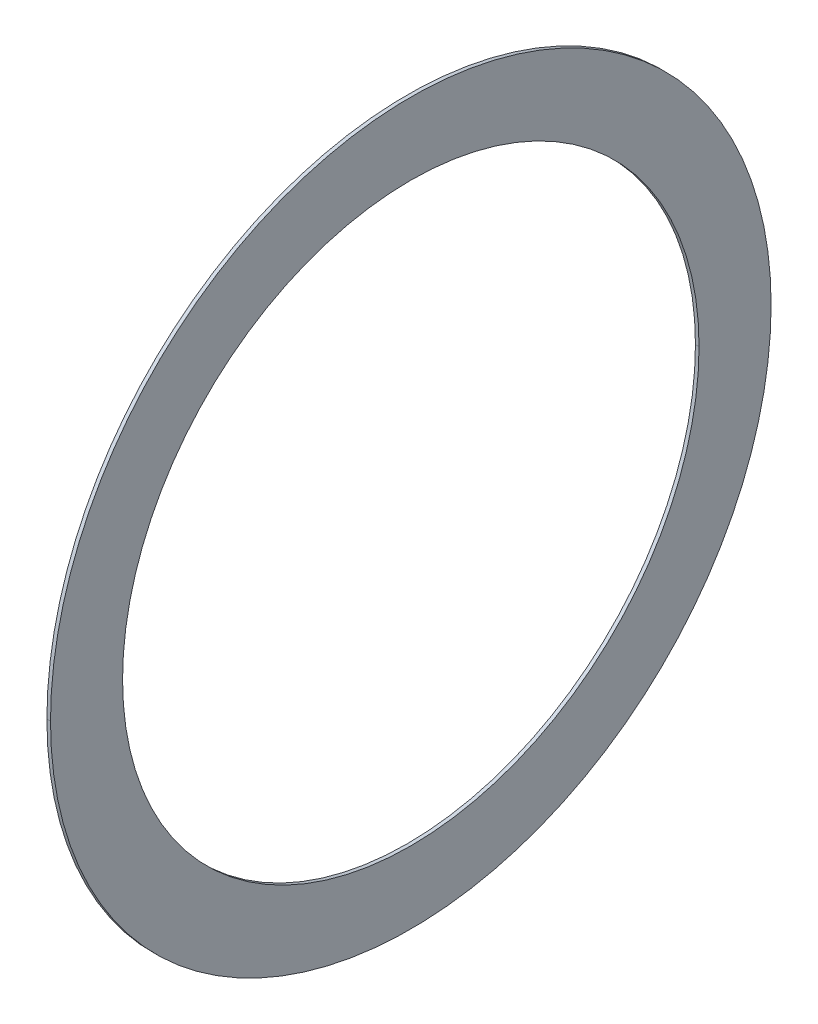
ISO-10303-21;
HEADER;
FILE_DESCRIPTION(('STEP AP214'),'2;1');
FILE_NAME('part.step','',(''),(''),'','','');
FILE_SCHEMA(('AUTOMOTIVE_DESIGN { 1 0 10303 214 1 1 1 1 }'));
ENDSEC;
DATA;
#1=APPLICATION_CONTEXT('core data for automotive mechanical design processes');
#2=APPLICATION_PROTOCOL_DEFINITION('international standard','automotive_design',2000,#1);
#3=PRODUCT_CONTEXT('',#1,'mechanical');
#4=PRODUCT('Part','Part','',(#3));
#5=PRODUCT_RELATED_PRODUCT_CATEGORY('part','',(#4));
#6=PRODUCT_DEFINITION_FORMATION('','',#4);
#7=PRODUCT_DEFINITION_CONTEXT('part definition',#1,'design');
#8=PRODUCT_DEFINITION('design','',#6,#7);
#9=PRODUCT_DEFINITION_SHAPE('','',#8);
#10=(LENGTH_UNIT() NAMED_UNIT(*) SI_UNIT(.MILLI.,.METRE.));
#11=(NAMED_UNIT(*) PLANE_ANGLE_UNIT() SI_UNIT($,.RADIAN.));
#12=(NAMED_UNIT(*) SI_UNIT($,.STERADIAN.) SOLID_ANGLE_UNIT());
#13=UNCERTAINTY_MEASURE_WITH_UNIT(LENGTH_MEASURE(1.E-05),#10,'distance_accuracy_value','');
#14=(GEOMETRIC_REPRESENTATION_CONTEXT(3) GLOBAL_UNCERTAINTY_ASSIGNED_CONTEXT((#13)) GLOBAL_UNIT_ASSIGNED_CONTEXT((#10,
#11,#12)) REPRESENTATION_CONTEXT('',''));
#15=CARTESIAN_POINT('',(0.,0.,0.));
#16=DIRECTION('',(0.,0.,1.));
#17=DIRECTION('',(1.,0.,0.));
#18=AXIS2_PLACEMENT_3D('',#15,#16,#17);
#19=CARTESIAN_POINT('',(2.5,100.,0.));
#20=DIRECTION('',(-1.,0.,0.));
#21=DIRECTION('',(0.,0.,1.));
#22=AXIS2_PLACEMENT_3D('',#19,#20,#21);
#23=PLANE('',#22);
#24=CARTESIAN_POINT('',(2.5,0.,0.));
#25=DIRECTION('',(1.,0.,0.));
#26=DIRECTION('',(0.,0.,-1.));
#27=AXIS2_PLACEMENT_3D('',#24,#25,#26);
#28=CIRCLE('',#27,80.);
#29=CARTESIAN_POINT('',(2.5,0.,-80.));
#30=VERTEX_POINT('',#29);
#31=CARTESIAN_POINT('',(2.5,0.,80.));
#32=VERTEX_POINT('',#31);
#33=EDGE_CURVE('E11',#30,#32,#28,.T.);
#34=ORIENTED_EDGE('',*,*,#33,.T.);
#35=CARTESIAN_POINT('',(2.5,0.,0.));
#36=DIRECTION('',(1.,0.,0.));
#37=DIRECTION('',(0.,0.,-1.));
#38=AXIS2_PLACEMENT_3D('',#35,#36,#37);
#39=CIRCLE('',#38,80.);
#40=EDGE_CURVE('E25',#32,#30,#39,.T.);
#41=ORIENTED_EDGE('',*,*,#40,.T.);
#42=EDGE_LOOP('',(#34,#41));
#43=FACE_BOUND('',#42,.T.);
#44=CARTESIAN_POINT('',(2.5,0.,0.));
#45=DIRECTION('',(1.,0.,0.));
#46=DIRECTION('',(0.,0.,-1.));
#47=AXIS2_PLACEMENT_3D('',#44,#45,#46);
#48=CIRCLE('',#47,100.);
#49=CARTESIAN_POINT('',(2.5,0.,100.));
#50=VERTEX_POINT('',#49);
#51=CARTESIAN_POINT('',(2.5,0.,-100.));
#52=VERTEX_POINT('',#51);
#53=EDGE_CURVE('E95',#50,#52,#48,.T.);
#54=ORIENTED_EDGE('',*,*,#53,.F.);
#55=CARTESIAN_POINT('',(2.5,0.,0.));
#56=DIRECTION('',(1.,0.,0.));
#57=DIRECTION('',(0.,0.,-1.));
#58=AXIS2_PLACEMENT_3D('',#55,#56,#57);
#59=CIRCLE('',#58,100.);
#60=EDGE_CURVE('E90',#52,#50,#59,.T.);
#61=ORIENTED_EDGE('',*,*,#60,.F.);
#62=EDGE_LOOP('',(#54,#61));
#63=FACE_BOUND('',#62,.T.);
#64=ADVANCED_FACE('F17',(#43,#63),#23,.T.);
#65=CARTESIAN_POINT('',(50.,0.,0.));
#66=DIRECTION('',(1.,0.,0.));
#67=DIRECTION('',(0.,-1.,0.));
#68=AXIS2_PLACEMENT_3D('',#65,#66,#67);
#69=CYLINDRICAL_SURFACE('',#68,100.);
#70=DIRECTION('',(1.,0.,0.));
#71=VECTOR('',#70,1.);
#72=CARTESIAN_POINT('',(2.5,0.,100.));
#73=LINE('',#72,#71);
#74=CARTESIAN_POINT('',(3.5,0.,100.));
#75=VERTEX_POINT('',#74);
#76=EDGE_CURVE('E86',#50,#75,#73,.T.);
#77=ORIENTED_EDGE('',*,*,#76,.T.);
#78=CARTESIAN_POINT('',(3.5,0.,0.));
#79=DIRECTION('',(1.,0.,0.));
#80=DIRECTION('',(0.,0.,-1.));
#81=AXIS2_PLACEMENT_3D('',#78,#79,#80);
#82=CIRCLE('',#81,100.);
#83=CARTESIAN_POINT('',(3.5,0.,-100.));
#84=VERTEX_POINT('',#83);
#85=EDGE_CURVE('E81',#84,#75,#82,.T.);
#86=ORIENTED_EDGE('',*,*,#85,.F.);
#87=DIRECTION('',(1.,0.,0.));
#88=VECTOR('',#87,1.);
#89=CARTESIAN_POINT('',(2.5,0.,-100.));
#90=LINE('',#89,#88);
#91=EDGE_CURVE('E70',#52,#84,#90,.T.);
#92=ORIENTED_EDGE('',*,*,#91,.F.);
#93=ORIENTED_EDGE('',*,*,#60,.T.);
#94=EDGE_LOOP('',(#77,#86,#92,#93));
#95=FACE_BOUND('',#94,.T.);
#96=ADVANCED_FACE('F111',(#95),#69,.T.);
#97=CARTESIAN_POINT('',(50.,0.,0.));
#98=DIRECTION('',(1.,0.,0.));
#99=DIRECTION('',(0.,1.,0.));
#100=AXIS2_PLACEMENT_3D('',#97,#98,#99);
#101=CYLINDRICAL_SURFACE('',#100,100.);
#102=ORIENTED_EDGE('',*,*,#76,.F.);
#103=ORIENTED_EDGE('',*,*,#53,.T.);
#104=ORIENTED_EDGE('',*,*,#91,.T.);
#105=CARTESIAN_POINT('',(3.5,0.,0.));
#106=DIRECTION('',(1.,0.,0.));
#107=DIRECTION('',(0.,0.,-1.));
#108=AXIS2_PLACEMENT_3D('',#105,#106,#107);
#109=CIRCLE('',#108,100.);
#110=EDGE_CURVE('E67',#75,#84,#109,.T.);
#111=ORIENTED_EDGE('',*,*,#110,.F.);
#112=EDGE_LOOP('',(#102,#103,#104,#111));
#113=FACE_BOUND('',#112,.T.);
#114=ADVANCED_FACE('F106',(#113),#101,.T.);
#115=CARTESIAN_POINT('',(3.5,80.,0.));
#116=DIRECTION('',(1.,0.,0.));
#117=DIRECTION('',(0.,0.,-1.));
#118=AXIS2_PLACEMENT_3D('',#115,#116,#117);
#119=PLANE('',#118);
#120=ORIENTED_EDGE('',*,*,#85,.T.);
#121=ORIENTED_EDGE('',*,*,#110,.T.);
#122=EDGE_LOOP('',(#120,#121));
#123=FACE_BOUND('',#122,.T.);
#124=CARTESIAN_POINT('',(3.5,0.,0.));
#125=DIRECTION('',(1.,0.,0.));
#126=DIRECTION('',(0.,0.,-1.));
#127=AXIS2_PLACEMENT_3D('',#124,#125,#126);
#128=CIRCLE('',#127,80.);
#129=CARTESIAN_POINT('',(3.5,0.,80.));
#130=VERTEX_POINT('',#129);
#131=CARTESIAN_POINT('',(3.5,0.,-80.));
#132=VERTEX_POINT('',#131);
#133=EDGE_CURVE('E55',#130,#132,#128,.T.);
#134=ORIENTED_EDGE('',*,*,#133,.F.);
#135=CARTESIAN_POINT('',(3.5,0.,0.));
#136=DIRECTION('',(1.,0.,0.));
#137=DIRECTION('',(0.,0.,-1.));
#138=AXIS2_PLACEMENT_3D('',#135,#136,#137);
#139=CIRCLE('',#138,80.);
#140=EDGE_CURVE('E51',#132,#130,#139,.T.);
#141=ORIENTED_EDGE('',*,*,#140,.F.);
#142=EDGE_LOOP('',(#134,#141));
#143=FACE_BOUND('',#142,.T.);
#144=ADVANCED_FACE('F53',(#123,#143),#119,.T.);
#145=CARTESIAN_POINT('',(50.,0.,0.));
#146=DIRECTION('',(1.,0.,0.));
#147=DIRECTION('',(0.,-1.,0.));
#148=AXIS2_PLACEMENT_3D('',#145,#146,#147);
#149=CYLINDRICAL_SURFACE('',#148,80.);
#150=DIRECTION('',(1.,0.,0.));
#151=VECTOR('',#150,1.);
#152=CARTESIAN_POINT('',(2.5,0.,80.));
#153=LINE('',#152,#151);
#154=EDGE_CURVE('E59',#32,#130,#153,.T.);
#155=ORIENTED_EDGE('',*,*,#154,.F.);
#156=ORIENTED_EDGE('',*,*,#33,.F.);
#157=DIRECTION('',(1.,0.,0.));
#158=VECTOR('',#157,1.);
#159=CARTESIAN_POINT('',(2.5,0.,-80.));
#160=LINE('',#159,#158);
#161=EDGE_CURVE('E62',#30,#132,#160,.T.);
#162=ORIENTED_EDGE('',*,*,#161,.T.);
#163=ORIENTED_EDGE('',*,*,#140,.T.);
#164=EDGE_LOOP('',(#155,#156,#162,#163));
#165=FACE_BOUND('',#164,.T.);
#166=ADVANCED_FACE('F63',(#165),#149,.F.);
#167=CARTESIAN_POINT('',(50.,0.,0.));
#168=DIRECTION('',(1.,0.,0.));
#169=DIRECTION('',(0.,1.,0.));
#170=AXIS2_PLACEMENT_3D('',#167,#168,#169);
#171=CYLINDRICAL_SURFACE('',#170,80.);
#172=ORIENTED_EDGE('',*,*,#154,.T.);
#173=ORIENTED_EDGE('',*,*,#133,.T.);
#174=ORIENTED_EDGE('',*,*,#161,.F.);
#175=ORIENTED_EDGE('',*,*,#40,.F.);
#176=EDGE_LOOP('',(#172,#173,#174,#175));
#177=FACE_BOUND('',#176,.T.);
#178=ADVANCED_FACE('F66',(#177),#171,.F.);
#179=CLOSED_SHELL('',(#64,#96,#114,#144,#166,#178));
#180=MANIFOLD_SOLID_BREP('B1',#179);
#181=ADVANCED_BREP_SHAPE_REPRESENTATION('',(#18,#180),#14);
#182=SHAPE_DEFINITION_REPRESENTATION(#9,#181);
ENDSEC;
END-ISO-10303-21;
